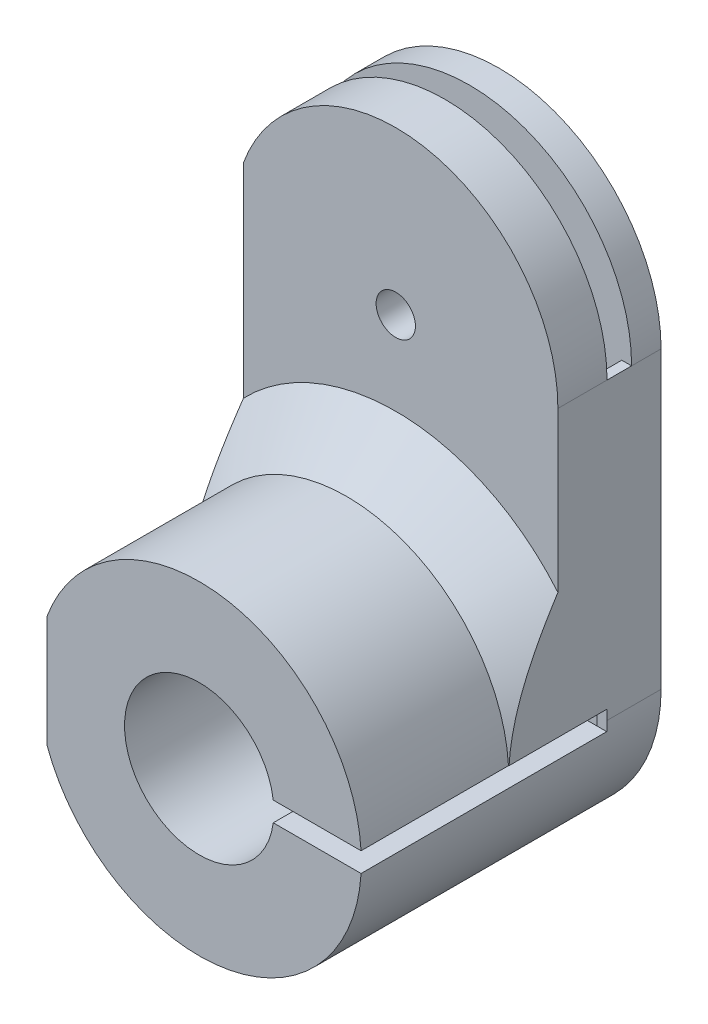
ISO-10303-21;
HEADER;
FILE_DESCRIPTION(('STEP AP214'),'2;1');
FILE_NAME('part.step','',(''),(''),'','','');
FILE_SCHEMA(('AUTOMOTIVE_DESIGN { 1 0 10303 214 1 1 1 1 }'));
ENDSEC;
DATA;
#1=APPLICATION_CONTEXT('core data for automotive mechanical design processes');
#2=APPLICATION_PROTOCOL_DEFINITION('international standard','automotive_design',2000,#1);
#3=PRODUCT_CONTEXT('',#1,'mechanical');
#4=PRODUCT('Part','Part','',(#3));
#5=PRODUCT_RELATED_PRODUCT_CATEGORY('part','',(#4));
#6=PRODUCT_DEFINITION_FORMATION('','',#4);
#7=PRODUCT_DEFINITION_CONTEXT('part definition',#1,'design');
#8=PRODUCT_DEFINITION('design','',#6,#7);
#9=PRODUCT_DEFINITION_SHAPE('','',#8);
#10=(LENGTH_UNIT() NAMED_UNIT(*) SI_UNIT(.MILLI.,.METRE.));
#11=(NAMED_UNIT(*) PLANE_ANGLE_UNIT() SI_UNIT($,.RADIAN.));
#12=(NAMED_UNIT(*) SI_UNIT($,.STERADIAN.) SOLID_ANGLE_UNIT());
#13=UNCERTAINTY_MEASURE_WITH_UNIT(LENGTH_MEASURE(1.E-05),#10,'distance_accuracy_value','');
#14=(GEOMETRIC_REPRESENTATION_CONTEXT(3) GLOBAL_UNCERTAINTY_ASSIGNED_CONTEXT((#13)) GLOBAL_UNIT_ASSIGNED_CONTEXT((#10,
#11,#12)) REPRESENTATION_CONTEXT('',''));
#15=CARTESIAN_POINT('',(0.,0.,0.));
#16=DIRECTION('',(0.,0.,1.));
#17=DIRECTION('',(1.,0.,0.));
#18=AXIS2_PLACEMENT_3D('',#15,#16,#17);
#19=CARTESIAN_POINT('',(0.,0.,0.));
#20=DIRECTION('',(0.,0.,1.));
#21=DIRECTION('',(1.,0.,0.));
#22=AXIS2_PLACEMENT_3D('',#19,#20,#21);
#23=PLANE('',#22);
#24=CARTESIAN_POINT('',(0.,30.,0.));
#25=DIRECTION('',(0.,0.,1.));
#26=DIRECTION('',(1.,0.,0.));
#27=AXIS2_PLACEMENT_3D('',#24,#25,#26);
#28=CIRCLE('',#27,2.);
#29=CARTESIAN_POINT('',(2.,30.,0.));
#30=VERTEX_POINT('',#29);
#31=EDGE_CURVE('E216',#30,#30,#28,.T.);
#32=ORIENTED_EDGE('',*,*,#31,.T.);
#33=EDGE_LOOP('',(#32));
#34=FACE_BOUND('',#33,.T.);
#35=DIRECTION('',(0.,-1.,0.));
#36=VECTOR('',#35,1.);
#37=CARTESIAN_POINT('',(-15.5,0.,0.));
#38=LINE('',#37,#36);
#39=CARTESIAN_POINT('',(-15.5,35.6568542494924,0.));
#40=VERTEX_POINT('',#39);
#41=CARTESIAN_POINT('',(-15.5,0.,0.));
#42=VERTEX_POINT('',#41);
#43=EDGE_CURVE('E381',#40,#42,#38,.T.);
#44=ORIENTED_EDGE('',*,*,#43,.F.);
#45=CARTESIAN_POINT('',(0.,30.,0.));
#46=DIRECTION('',(0.,0.,1.));
#47=DIRECTION('',(-1.,0.,0.));
#48=AXIS2_PLACEMENT_3D('',#45,#46,#47);
#49=CIRCLE('',#48,16.5);
#50=CARTESIAN_POINT('',(16.5,30.,0.));
#51=VERTEX_POINT('',#50);
#52=EDGE_CURVE('E220',#51,#40,#49,.T.);
#53=ORIENTED_EDGE('',*,*,#52,.F.);
#54=DIRECTION('',(-1.,0.,0.));
#55=VECTOR('',#54,1.);
#56=CARTESIAN_POINT('',(0.,30.,0.));
#57=LINE('',#56,#55);
#58=CARTESIAN_POINT('',(15.5,30.,0.));
#59=VERTEX_POINT('',#58);
#60=EDGE_CURVE('E196',#51,#59,#57,.T.);
#61=ORIENTED_EDGE('',*,*,#60,.T.);
#62=DIRECTION('',(0.,-1.,0.));
#63=VECTOR('',#62,1.);
#64=CARTESIAN_POINT('',(15.5,0.,0.));
#65=LINE('',#64,#63);
#66=CARTESIAN_POINT('',(15.5,1.,0.));
#67=VERTEX_POINT('',#66);
#68=EDGE_CURVE('E409',#59,#67,#65,.T.);
#69=ORIENTED_EDGE('',*,*,#68,.T.);
#70=DIRECTION('',(-1.,0.,0.));
#71=VECTOR('',#70,1.);
#72=CARTESIAN_POINT('',(0.,1.,0.));
#73=LINE('',#72,#71);
#74=CARTESIAN_POINT('',(7.53392328073495,1.,0.));
#75=VERTEX_POINT('',#74);
#76=EDGE_CURVE('E383',#67,#75,#73,.T.);
#77=ORIENTED_EDGE('',*,*,#76,.T.);
#78=CARTESIAN_POINT('',(0.,0.,0.));
#79=DIRECTION('',(0.,0.,1.));
#80=DIRECTION('',(1.,0.,0.));
#81=AXIS2_PLACEMENT_3D('',#78,#79,#80);
#82=CIRCLE('',#81,7.6);
#83=CARTESIAN_POINT('',(7.53392328073495,-1.,0.));
#84=VERTEX_POINT('',#83);
#85=EDGE_CURVE('E213',#75,#84,#82,.T.);
#86=ORIENTED_EDGE('',*,*,#85,.T.);
#87=DIRECTION('',(-1.,0.,0.));
#88=VECTOR('',#87,1.);
#89=CARTESIAN_POINT('',(0.,-1.,0.));
#90=LINE('',#89,#88);
#91=CARTESIAN_POINT('',(15.467708298258,-1.,0.));
#92=VERTEX_POINT('',#91);
#93=EDGE_CURVE('E391',#92,#84,#90,.T.);
#94=ORIENTED_EDGE('',*,*,#93,.F.);
#95=CARTESIAN_POINT('',(0.,0.,0.));
#96=DIRECTION('',(0.,0.,1.));
#97=DIRECTION('',(1.,0.,0.));
#98=AXIS2_PLACEMENT_3D('',#95,#96,#97);
#99=CIRCLE('',#98,15.5);
#100=EDGE_CURVE('E246',#92,#42,#99,.F.);
#101=ORIENTED_EDGE('',*,*,#100,.T.);
#102=EDGE_LOOP('',(#44,#53,#61,#69,#77,#86,#94,#101));
#103=FACE_BOUND('',#102,.T.);
#104=ADVANCED_FACE('F33',(#34,#103),#23,.F.);
#105=CARTESIAN_POINT('',(0.,0.,5.));
#106=DIRECTION('',(0.,0.,-1.));
#107=DIRECTION('',(-1.,0.,0.));
#108=AXIS2_PLACEMENT_3D('',#105,#106,#107);
#109=CYLINDRICAL_SURFACE('',#108,16.5);
#110=DIRECTION('',(0.,0.,-1.));
#111=VECTOR('',#110,1.);
#112=CARTESIAN_POINT('',(-15.5,5.65685424949238,5.));
#113=LINE('',#112,#111);
#114=CARTESIAN_POINT('',(-15.5,5.65685424949238,25.));
#115=VERTEX_POINT('',#114);
#116=CARTESIAN_POINT('',(-15.5,5.65685424949238,10.));
#117=VERTEX_POINT('',#116);
#118=EDGE_CURVE('E270',#115,#117,#113,.T.);
#119=ORIENTED_EDGE('',*,*,#118,.F.);
#120=CARTESIAN_POINT('',(0.,0.,25.));
#121=DIRECTION('',(0.,0.,1.));
#122=DIRECTION('',(1.,0.,0.));
#123=AXIS2_PLACEMENT_3D('',#120,#121,#122);
#124=CIRCLE('',#123,16.5);
#125=CARTESIAN_POINT('',(16.4696690920006,1.,25.));
#126=VERTEX_POINT('',#125);
#127=EDGE_CURVE('E210',#126,#115,#124,.T.);
#128=ORIENTED_EDGE('',*,*,#127,.F.);
#129=DIRECTION('',(0.,0.,-1.));
#130=VECTOR('',#129,1.);
#131=CARTESIAN_POINT('',(16.4696690920006,1.,5.));
#132=LINE('',#131,#130);
#133=CARTESIAN_POINT('',(16.4696690920006,1.,10.));
#134=VERTEX_POINT('',#133);
#135=EDGE_CURVE('E286',#134,#126,#132,.F.);
#136=ORIENTED_EDGE('',*,*,#135,.F.);
#137=CARTESIAN_POINT('',(0.,0.,10.));
#138=DIRECTION('',(0.,0.,1.));
#139=DIRECTION('',(1.,0.,0.));
#140=AXIS2_PLACEMENT_3D('',#137,#138,#139);
#141=CIRCLE('',#140,16.5);
#142=EDGE_CURVE('E234',#134,#117,#141,.T.);
#143=ORIENTED_EDGE('',*,*,#142,.T.);
#144=EDGE_LOOP('',(#119,#128,#136,#143));
#145=FACE_BOUND('',#144,.T.);
#146=ADVANCED_FACE('F257',(#145),#109,.T.);
#147=DIRECTION('',(0.,0.,-1.));
#148=VECTOR('',#147,1.);
#149=CARTESIAN_POINT('',(-15.5,-5.65685424949238,5.));
#150=LINE('',#149,#148);
#151=CARTESIAN_POINT('',(-15.5,-5.65685424949238,-5.5));
#152=VERTEX_POINT('',#151);
#153=CARTESIAN_POINT('',(-15.5,-5.65685424949238,25.));
#154=VERTEX_POINT('',#153);
#155=EDGE_CURVE('E165',#152,#154,#150,.F.);
#156=ORIENTED_EDGE('',*,*,#155,.F.);
#157=CARTESIAN_POINT('',(0.,0.,-5.5));
#158=DIRECTION('',(0.,0.,-1.));
#159=DIRECTION('',(-1.,0.,0.));
#160=AXIS2_PLACEMENT_3D('',#157,#158,#159);
#161=CIRCLE('',#160,16.5);
#162=CARTESIAN_POINT('',(16.5,0.,-5.5));
#163=VERTEX_POINT('',#162);
#164=EDGE_CURVE('E164',#163,#152,#161,.T.);
#165=ORIENTED_EDGE('',*,*,#164,.F.);
#166=DIRECTION('',(0.,0.,-1.));
#167=VECTOR('',#166,1.);
#168=CARTESIAN_POINT('',(16.5,0.,5.));
#169=LINE('',#168,#167);
#170=CARTESIAN_POINT('',(16.5,0.,0.));
#171=VERTEX_POINT('',#170);
#172=EDGE_CURVE('E232',#171,#163,#169,.T.);
#173=ORIENTED_EDGE('',*,*,#172,.F.);
#174=CARTESIAN_POINT('',(0.,0.,0.));
#175=DIRECTION('',(0.,0.,1.));
#176=DIRECTION('',(1.,0.,0.));
#177=AXIS2_PLACEMENT_3D('',#174,#175,#176);
#178=CIRCLE('',#177,16.5);
#179=CARTESIAN_POINT('',(16.4696690920006,-1.,0.));
#180=VERTEX_POINT('',#179);
#181=EDGE_CURVE('E299',#180,#171,#178,.T.);
#182=ORIENTED_EDGE('',*,*,#181,.F.);
#183=DIRECTION('',(0.,0.,-1.));
#184=VECTOR('',#183,1.);
#185=CARTESIAN_POINT('',(16.4696690920006,-1.,5.));
#186=LINE('',#185,#184);
#187=CARTESIAN_POINT('',(16.4696690920006,-1.,25.));
#188=VERTEX_POINT('',#187);
#189=EDGE_CURVE('E294',#180,#188,#186,.F.);
#190=ORIENTED_EDGE('',*,*,#189,.T.);
#191=EDGE_CURVE('E209',#154,#188,#124,.T.);
#192=ORIENTED_EDGE('',*,*,#191,.F.);
#193=EDGE_LOOP('',(#156,#165,#173,#182,#190,#192));
#194=FACE_BOUND('',#193,.T.);
#195=ADVANCED_FACE('F259',(#194),#109,.T.);
#196=CARTESIAN_POINT('',(0.,0.,25.));
#197=DIRECTION('',(0.,0.,1.));
#198=DIRECTION('',(1.,0.,0.));
#199=AXIS2_PLACEMENT_3D('',#196,#197,#198);
#200=PLANE('',#199);
#201=ORIENTED_EDGE('',*,*,#127,.T.);
#202=DIRECTION('',(0.,-1.,0.));
#203=VECTOR('',#202,1.);
#204=CARTESIAN_POINT('',(-15.5,0.,25.));
#205=LINE('',#204,#203);
#206=EDGE_CURVE('E275',#115,#154,#205,.T.);
#207=ORIENTED_EDGE('',*,*,#206,.T.);
#208=ORIENTED_EDGE('',*,*,#191,.T.);
#209=DIRECTION('',(1.,0.,0.));
#210=VECTOR('',#209,1.);
#211=CARTESIAN_POINT('',(0.,-1.,25.));
#212=LINE('',#211,#210);
#213=CARTESIAN_POINT('',(7.53392328073495,-1.,25.));
#214=VERTEX_POINT('',#213);
#215=EDGE_CURVE('E42',#214,#188,#212,.T.);
#216=ORIENTED_EDGE('',*,*,#215,.F.);
#217=CARTESIAN_POINT('',(0.,0.,25.));
#218=DIRECTION('',(0.,0.,1.));
#219=DIRECTION('',(1.,0.,0.));
#220=AXIS2_PLACEMENT_3D('',#217,#218,#219);
#221=CIRCLE('',#220,7.6);
#222=CARTESIAN_POINT('',(7.53392328073495,1.,25.));
#223=VERTEX_POINT('',#222);
#224=EDGE_CURVE('E206',#223,#214,#221,.T.);
#225=ORIENTED_EDGE('',*,*,#224,.F.);
#226=DIRECTION('',(1.,0.,0.));
#227=VECTOR('',#226,1.);
#228=CARTESIAN_POINT('',(0.,1.,25.));
#229=LINE('',#228,#227);
#230=EDGE_CURVE('E282',#223,#126,#229,.T.);
#231=ORIENTED_EDGE('',*,*,#230,.T.);
#232=EDGE_LOOP('',(#201,#207,#208,#216,#225,#231));
#233=FACE_BOUND('',#232,.T.);
#234=ADVANCED_FACE('F265',(#233),#200,.T.);
#235=CARTESIAN_POINT('',(0.,0.,10.));
#236=DIRECTION('',(0.,0.,-1.));
#237=DIRECTION('',(-1.,0.,0.));
#238=AXIS2_PLACEMENT_3D('',#235,#236,#237);
#239=CONICAL_SURFACE('',#238,16.5,0.785398163397443);
#240=CARTESIAN_POINT('',(-15.5,-13.4883542311077,5.95284204898787));
#241=CARTESIAN_POINT('',(-15.5,-13.1619832522316,6.16705353127233));
#242=CARTESIAN_POINT('',(-15.5,-12.8335937065472,6.37823790255222));
#243=CARTESIAN_POINT('',(-15.5,-12.1722333871304,6.79348836651693));
#244=CARTESIAN_POINT('',(-15.5,-11.8392614725238,6.99755264010608));
#245=CARTESIAN_POINT('',(-15.5,-11.1666570638379,7.3984024055747));
#246=CARTESIAN_POINT('',(-15.5,-10.8269993634294,7.59514575939079));
#247=CARTESIAN_POINT('',(-15.5,-10.1422085932458,7.97882476474934));
#248=CARTESIAN_POINT('',(-15.5,-9.7970758812883,8.16576105381804));
#249=CARTESIAN_POINT('',(-15.5,-9.09088478248684,8.53334381616271));
#250=CARTESIAN_POINT('',(-15.5,-8.72965279622625,8.71365942488712));
#251=CARTESIAN_POINT('',(-15.5,-8.00042044868424,9.05999601914646));
#252=CARTESIAN_POINT('',(-15.5,-7.63241960669504,9.22601598464545));
#253=CARTESIAN_POINT('',(-15.5,-6.51899529138525,9.69832885620541));
#254=CARTESIAN_POINT('',(-15.5,-5.76249791704777,9.97975894141957));
#255=CARTESIAN_POINT('',(-15.5,-4.53317338678211,10.3566110685937));
#256=CARTESIAN_POINT('',(-15.5,-4.06925437505357,10.4812416084303));
#257=CARTESIAN_POINT('',(-15.5,-3.13278403080684,10.6931498792374));
#258=CARTESIAN_POINT('',(-15.5,-2.66023247665344,10.7804266497635));
#259=CARTESIAN_POINT('',(-15.5,-1.71433324313486,10.91243684098));
#260=CARTESIAN_POINT('',(-15.5,-1.2410488966195,10.957618129778));
#261=CARTESIAN_POINT('',(-15.5,-0.292320742154641,11.004482095324));
#262=CARTESIAN_POINT('',(-15.5,0.183122928344076,11.0061675030197));
#263=CARTESIAN_POINT('',(-15.5,1.13353822545524,10.965883898091));
#264=CARTESIAN_POINT('',(-15.5,1.60850427295816,10.9237854383831));
#265=CARTESIAN_POINT('',(-15.5,2.55288316159106,10.7981528355441));
#266=CARTESIAN_POINT('',(-15.5,3.0222954219117,10.7146143972008));
#267=CARTESIAN_POINT('',(-15.5,3.95548989711239,10.5097742119244));
#268=CARTESIAN_POINT('',(-15.5,4.41922495847328,10.3882605621542));
#269=CARTESIAN_POINT('',(-15.5,5.33683050095344,10.1128068694402));
#270=CARTESIAN_POINT('',(-15.5,5.79070102235302,9.95886695893127));
#271=CARTESIAN_POINT('',(-15.5,6.78858348458831,9.58624318689272));
#272=CARTESIAN_POINT('',(-15.5,7.33004770955227,9.36077951327062));
#273=CARTESIAN_POINT('',(-15.5,8.39841228078049,8.87739582954841));
#274=CARTESIAN_POINT('',(-15.5,8.92530521990447,8.61945966933635));
#275=CARTESIAN_POINT('',(-15.5,9.96669444782814,8.07754250933706));
#276=CARTESIAN_POINT('',(-15.5,10.4811652170735,7.79351284440653));
#277=CARTESIAN_POINT('',(-15.5,11.4982359113583,7.20524936091089));
#278=CARTESIAN_POINT('',(-15.5,12.0008376957541,6.90101873581001));
#279=CARTESIAN_POINT('',(-15.5,13.0006681003233,6.2734206409208));
#280=CARTESIAN_POINT('',(-15.5,13.4977981944576,5.94989694446391));
#281=CARTESIAN_POINT('',(-15.5,14.4831958095876,5.28964298320991));
#282=CARTESIAN_POINT('',(-15.5,14.9714630752239,4.95291233876956));
#283=CARTESIAN_POINT('',(-15.5,15.9398854812326,4.26910838714908));
#284=CARTESIAN_POINT('',(-15.5,16.4200488469545,3.92204669580113));
#285=CARTESIAN_POINT('',(-15.5,17.3738849451342,3.21914868456798));
#286=CARTESIAN_POINT('',(-15.5,17.8475577492467,2.86331246167366));
#287=CARTESIAN_POINT('',(-15.5,18.9716725994811,2.00518333289196));
#288=CARTESIAN_POINT('',(-15.5,19.6195467649418,1.4995294316936));
#289=CARTESIAN_POINT('',(-15.5,20.9065882173327,0.477263920757578));
#290=CARTESIAN_POINT('',(-15.5,21.545755283161,-0.0393479663908997));
#291=CARTESIAN_POINT('',(-15.5,22.8172028935836,-1.08155426375353));
#292=CARTESIAN_POINT('',(-15.5,23.4494801399158,-1.60715269116617));
#293=CARTESIAN_POINT('',(-15.5,24.7080737881168,-2.6654411066379));
#294=CARTESIAN_POINT('',(-15.5,25.3343901266641,-3.19813116988593));
#295=CARTESIAN_POINT('',(-15.5,26.561732049975,-4.25190924040628));
#296=CARTESIAN_POINT('',(-15.5,27.1629176555315,-4.77281109040549));
#297=CARTESIAN_POINT('',(-15.5,28.3613135581328,-5.81917151641213));
#298=CARTESIAN_POINT('',(-15.5,28.9585238308936,-6.34463012021028));
#299=CARTESIAN_POINT('',(-15.5,30.1490314173354,-7.39893202318439));
#300=CARTESIAN_POINT('',(-15.5,30.7423316509627,-7.92777202809512));
#301=CARTESIAN_POINT('',(-15.5,31.925975371818,-8.98872606110795));
#302=CARTESIAN_POINT('',(-15.5,32.5163189224001,-9.52084001850839));
#303=CARTESIAN_POINT('',(-15.5,33.1054163632002,-10.0543238561576));
#304=B_SPLINE_CURVE_WITH_KNOTS('',3,(#240,#241,#242,#243,#244,#245,#246,#247,#248,#249,#250,
#251,#252,#253,#254,#255,#256,#257,#258,#259,#260,#261,#262,#263,#264,#265,#266,#267,#268,#269,
#270,#271,#272,#273,#274,#275,#276,#277,#278,#279,#280,#281,#282,#283,#284,#285,#286,#287,#288,
#289,#290,#291,#292,#293,#294,#295,#296,#297,#298,#299,#300,#301,#302,#303),.UNSPECIFIED.,.F.,
.F.,(4,2,2,2,2,2,2,2,2,2,2,2,2,2,2,2,2,2,2,2,2,2,2,2,2,2,2,2,2,2,2,4),(0.,1.17119300864336,
2.34268308343275,3.52011125795475,4.6974627965125,5.90835257926607,7.11932869107438,
9.53567484724216,10.9755337079724,12.415429588291,13.8398248819925,15.2641307428973,
16.6926595699075,18.1213364934508,19.5581322756454,20.994922189807,22.7531207794902,
24.5121972852607,26.2746238337442,28.0367724297053,29.8159107295443,31.5951002095348,
33.3723596488714,35.1495994517429,37.6149686015868,40.0804002390299,42.5469643965116,
45.0135547265533,47.3999198150042,49.7862994676686,52.1706297289689,54.5549086796505),.UNSPECIFIED.);
#305=CARTESIAN_POINT('',(-15.5,14.8996644257513,5.));
#306=VERTEX_POINT('',#305);
#307=EDGE_CURVE('E274',#117,#306,#304,.T.);
#308=ORIENTED_EDGE('',*,*,#307,.F.);
#309=ORIENTED_EDGE('',*,*,#142,.F.);
#310=CARTESIAN_POINT('',(31.2831715319293,1.,-4.79915048521479));
#311=CARTESIAN_POINT('',(30.1008553973261,1.,-3.61744507814936));
#312=CARTESIAN_POINT('',(28.9185116923515,1.,-2.4357672469429));
#313=CARTESIAN_POINT('',(26.5537267769889,1.,-0.072513583927103));
#314=CARTESIAN_POINT('',(25.3712855667876,1.,1.10906224806915));
#315=CARTESIAN_POINT('',(23.0062649787068,1.,3.47206336619539));
#316=CARTESIAN_POINT('',(21.8236856015755,1.,4.65348865307419));
#317=CARTESIAN_POINT('',(19.45829520654,1.,7.0161116459906));
#318=CARTESIAN_POINT('',(18.2754841882182,1.,8.19730935161013));
#319=CARTESIAN_POINT('',(16.500955700651,1.,9.96880602973445));
#320=CARTESIAN_POINT('',(15.9093910590625,1.,10.5592580872199));
#321=CARTESIAN_POINT('',(14.7261186292172,1.,11.740017917072));
#322=CARTESIAN_POINT('',(14.1344108410628,1.,12.3303256895412));
#323=CARTESIAN_POINT('',(12.9507919727244,1.,13.5107308219366));
#324=CARTESIAN_POINT('',(12.358880893688,1.,14.1008281830136));
#325=CARTESIAN_POINT('',(11.1747464485765,1.,15.2807125979036));
#326=CARTESIAN_POINT('',(10.5825230817079,1.,15.8704996509205));
#327=CARTESIAN_POINT('',(9.69379957029781,1.,16.7548014194667));
#328=CARTESIAN_POINT('',(9.39749076098087,1.,17.0495084164266));
#329=CARTESIAN_POINT('',(8.80470288447884,1.,17.6387507185763));
#330=CARTESIAN_POINT('',(8.50822381741781,1.,17.9332860238909));
#331=CARTESIAN_POINT('',(7.91503775261413,1.,18.5221220932866));
#332=CARTESIAN_POINT('',(7.61833075679678,1.,18.8164228593071));
#333=CARTESIAN_POINT('',(7.02459323555713,1.,19.4046995430662));
#334=CARTESIAN_POINT('',(6.72756270928031,1.,19.6986754599427));
#335=CARTESIAN_POINT('',(6.13301957714364,1.,20.2861573591968));
#336=CARTESIAN_POINT('',(5.83550695708718,1.,20.5796633272102));
#337=CARTESIAN_POINT('',(5.23975870565137,1.,21.1659371110513));
#338=CARTESIAN_POINT('',(4.94152307960413,1.,21.4587049322906));
#339=CARTESIAN_POINT('',(4.49324792400735,1.,21.8969246438991));
#340=CARTESIAN_POINT('',(4.34366663120819,1.,22.0428450857491));
#341=CARTESIAN_POINT('',(4.04408619578124,1.,22.3342553157224));
#342=CARTESIAN_POINT('',(3.89408705480348,1.,22.4797451055416));
#343=CARTESIAN_POINT('',(3.59351821633375,1.,22.7701431085312));
#344=CARTESIAN_POINT('',(3.44294850404442,1.,22.9150513064149));
#345=CARTESIAN_POINT('',(3.14095371372834,1.,23.2039772206253));
#346=CARTESIAN_POINT('',(2.98952862392232,1.,23.3479949246317));
#347=CARTESIAN_POINT('',(2.83753356590538,1.,23.4914128336313));
#348=B_SPLINE_CURVE_WITH_KNOTS('',3,(#310,#311,#312,#313,#314,#315,#316,#317,#318,#319,#320,
#321,#322,#323,#324,#325,#326,#327,#328,#329,#330,#331,#332,#333,#334,#335,#336,#337,#338,#339,
#340,#341,#342,#343,#344,#345,#346,#347),.UNSPECIFIED.,.F.,.F.,(4,2,2,2,2,2,2,2,2,2,2,2,2,2,2,2,
2,2,4),(0.,5.01484716582376,10.0296849381957,15.044496708635,20.0593176055556,22.5667547708475,
25.0741901465941,27.58161159189,30.0890394387897,31.3427778477935,32.5965153444058,
33.8502423647396,35.1039727044758,36.3577406602761,37.6114993975888,38.2384006728618,
38.8652994760673,39.4922146502662,40.1191384787745),.UNSPECIFIED.);
#349=CARTESIAN_POINT('',(16.5,0.999999999999146,9.96972474518355));
#350=VERTEX_POINT('',#349);
#351=EDGE_CURVE('E411',#350,#134,#348,.T.);
#352=ORIENTED_EDGE('',*,*,#351,.F.);
#353=CARTESIAN_POINT('',(16.5,13.7840487520902,5.));
#354=CARTESIAN_POINT('',(16.5,13.4425456268306,5.2189052123565));
#355=CARTESIAN_POINT('',(16.5,13.0988742342402,5.43448377999532));
#356=CARTESIAN_POINT('',(16.5,12.4066274426754,5.85783568646688));
#357=CARTESIAN_POINT('',(16.5,12.0580506663048,6.06560677038276));
#358=CARTESIAN_POINT('',(16.5,11.3539615113847,6.47302506923402));
#359=CARTESIAN_POINT('',(16.5,10.9984241457014,6.67262926412509));
#360=CARTESIAN_POINT('',(16.5,10.2815693653873,7.06112411321939));
#361=CARTESIAN_POINT('',(16.5,9.92025244071763,7.25001566947789));
#362=CARTESIAN_POINT('',(16.5,9.20234612287532,7.60979971606665));
#363=CARTESIAN_POINT('',(16.5,8.84594422522538,7.78106378289986));
#364=CARTESIAN_POINT('',(16.5,8.12690326092033,8.1099406529933));
#365=CARTESIAN_POINT('',(16.5,7.76426362930789,8.26755221184696));
#366=CARTESIAN_POINT('',(16.5,6.66779414010523,8.7161473846883));
#367=CARTESIAN_POINT('',(16.5,5.92390633267127,8.98366615755507));
#368=CARTESIAN_POINT('',(16.5,4.7522381620281,9.3338545266994));
#369=CARTESIAN_POINT('',(16.5,4.33301896998583,9.44550641159906));
#370=CARTESIAN_POINT('',(16.5,3.48793530117779,9.64037668202841));
#371=CARTESIAN_POINT('',(16.5,3.0620717849983,9.72359913856154));
#372=CARTESIAN_POINT('',(16.5,2.41620668270184,9.82541507355742));
#373=CARTESIAN_POINT('',(16.5,2.19799201571663,9.855662082048));
#374=CARTESIAN_POINT('',(16.5,1.7605541077037,9.90776036534952));
#375=CARTESIAN_POINT('',(16.5,1.54133088710275,9.92961180944929));
#376=CARTESIAN_POINT('',(16.5,1.1019442539286,9.96469527480129));
#377=CARTESIAN_POINT('',(16.5,0.881780054444317,9.97791744161697));
#378=CARTESIAN_POINT('',(16.5,0.441079104936033,9.99557871182797));
#379=CARTESIAN_POINT('',(16.5,0.22054232100369,10.0000169673364));
#380=CARTESIAN_POINT('',(16.5,0.,10.));
#381=B_SPLINE_CURVE_WITH_KNOTS('',3,(#353,#354,#355,#356,#357,#358,#359,#360,#361,#362,#363,
#364,#365,#366,#367,#368,#369,#370,#371,#372,#373,#374,#375,#376,#377,#378,#379,#380),
.UNSPECIFIED.,.F.,.F.,(4,2,2,2,2,2,2,2,2,2,2,2,2,4),(0.,1.21694547658333,2.4342397651579,
3.65728530392378,4.88022770304341,6.06618496298468,7.2522502077338,9.61930941570027,
10.9200394766905,12.2205831991317,12.8813523789289,13.5421082342227,14.2036173432923,
14.8651903029088),.UNSPECIFIED.);
#382=CARTESIAN_POINT('',(16.5,13.7840487520902,5.));
#383=VERTEX_POINT('',#382);
#384=EDGE_CURVE('E239',#383,#350,#381,.T.);
#385=ORIENTED_EDGE('',*,*,#384,.F.);
#386=CARTESIAN_POINT('',(0.,0.,5.));
#387=DIRECTION('',(0.,0.,1.));
#388=DIRECTION('',(1.,0.,0.));
#389=AXIS2_PLACEMENT_3D('',#386,#387,#388);
#390=CIRCLE('',#389,21.5);
#391=EDGE_CURVE('E237',#306,#383,#390,.F.);
#392=ORIENTED_EDGE('',*,*,#391,.F.);
#393=EDGE_LOOP('',(#308,#309,#352,#385,#392));
#394=FACE_BOUND('',#393,.T.);
#395=ADVANCED_FACE('F35',(#394),#239,.T.);
#396=CARTESIAN_POINT('',(0.,0.,5.));
#397=DIRECTION('',(0.,0.,1.));
#398=DIRECTION('',(1.,0.,0.));
#399=AXIS2_PLACEMENT_3D('',#396,#397,#398);
#400=PLANE('',#399);
#401=CARTESIAN_POINT('',(0.,30.,5.));
#402=DIRECTION('',(0.,0.,1.));
#403=DIRECTION('',(1.,0.,0.));
#404=AXIS2_PLACEMENT_3D('',#401,#402,#403);
#405=CIRCLE('',#404,2.);
#406=CARTESIAN_POINT('',(2.,30.,5.));
#407=VERTEX_POINT('',#406);
#408=EDGE_CURVE('E217',#407,#407,#405,.T.);
#409=ORIENTED_EDGE('',*,*,#408,.F.);
#410=EDGE_LOOP('',(#409));
#411=FACE_BOUND('',#410,.T.);
#412=CARTESIAN_POINT('',(0.,30.,5.));
#413=DIRECTION('',(0.,0.,1.));
#414=DIRECTION('',(-1.,0.,0.));
#415=AXIS2_PLACEMENT_3D('',#412,#413,#414);
#416=CIRCLE('',#415,16.5);
#417=CARTESIAN_POINT('',(16.5,30.,5.));
#418=VERTEX_POINT('',#417);
#419=CARTESIAN_POINT('',(-15.5,35.6568542494924,5.));
#420=VERTEX_POINT('',#419);
#421=EDGE_CURVE('E225',#418,#420,#416,.T.);
#422=ORIENTED_EDGE('',*,*,#421,.T.);
#423=DIRECTION('',(0.,-1.,0.));
#424=VECTOR('',#423,1.);
#425=CARTESIAN_POINT('',(-15.5,0.,5.));
#426=LINE('',#425,#424);
#427=EDGE_CURVE('E372',#420,#306,#426,.T.);
#428=ORIENTED_EDGE('',*,*,#427,.T.);
#429=ORIENTED_EDGE('',*,*,#391,.T.);
#430=DIRECTION('',(0.,1.,0.));
#431=VECTOR('',#430,1.);
#432=CARTESIAN_POINT('',(16.5,30.,5.));
#433=LINE('',#432,#431);
#434=EDGE_CURVE('E223',#383,#418,#433,.T.);
#435=ORIENTED_EDGE('',*,*,#434,.T.);
#436=EDGE_LOOP('',(#422,#428,#429,#435));
#437=FACE_BOUND('',#436,.T.);
#438=ADVANCED_FACE('F359',(#411,#437),#400,.T.);
#439=CARTESIAN_POINT('',(0.,30.,5.));
#440=DIRECTION('',(0.,0.,-1.));
#441=DIRECTION('',(-1.,0.,0.));
#442=AXIS2_PLACEMENT_3D('',#439,#440,#441);
#443=CYLINDRICAL_SURFACE('',#442,16.5);
#444=DIRECTION('',(0.,0.,-1.));
#445=VECTOR('',#444,1.);
#446=CARTESIAN_POINT('',(-15.5,35.6568542494924,5.));
#447=LINE('',#446,#445);
#448=EDGE_CURVE('E378',#420,#40,#447,.T.);
#449=ORIENTED_EDGE('',*,*,#448,.F.);
#450=ORIENTED_EDGE('',*,*,#421,.F.);
#451=DIRECTION('',(0.,0.,-1.));
#452=VECTOR('',#451,1.);
#453=CARTESIAN_POINT('',(16.5,30.,5.));
#454=LINE('',#453,#452);
#455=EDGE_CURVE('E228',#418,#51,#454,.T.);
#456=ORIENTED_EDGE('',*,*,#455,.T.);
#457=ORIENTED_EDGE('',*,*,#52,.T.);
#458=EDGE_LOOP('',(#449,#450,#456,#457));
#459=FACE_BOUND('',#458,.T.);
#460=ADVANCED_FACE('F255',(#459),#443,.T.);
#461=CARTESIAN_POINT('',(0.,0.,-5.5));
#462=DIRECTION('',(0.,0.,-1.));
#463=DIRECTION('',(-1.,0.,0.));
#464=AXIS2_PLACEMENT_3D('',#461,#462,#463);
#465=PLANE('',#464);
#466=CARTESIAN_POINT('',(0.,0.,-5.5));
#467=DIRECTION('',(0.,0.,-1.));
#468=DIRECTION('',(-1.,0.,0.));
#469=AXIS2_PLACEMENT_3D('',#466,#467,#468);
#470=CIRCLE('',#469,7.6);
#471=CARTESIAN_POINT('',(-7.6,0.,-5.5));
#472=VERTEX_POINT('',#471);
#473=EDGE_CURVE('E175',#472,#472,#470,.T.);
#474=ORIENTED_EDGE('',*,*,#473,.F.);
#475=EDGE_LOOP('',(#474));
#476=FACE_BOUND('',#475,.T.);
#477=CARTESIAN_POINT('',(0.,30.,-5.5));
#478=DIRECTION('',(0.,0.,-1.));
#479=DIRECTION('',(-1.,0.,0.));
#480=AXIS2_PLACEMENT_3D('',#477,#478,#479);
#481=CIRCLE('',#480,2.);
#482=CARTESIAN_POINT('',(-2.,30.,-5.5));
#483=VERTEX_POINT('',#482);
#484=EDGE_CURVE('E305',#483,#483,#481,.T.);
#485=ORIENTED_EDGE('',*,*,#484,.F.);
#486=EDGE_LOOP('',(#485));
#487=FACE_BOUND('',#486,.T.);
#488=ORIENTED_EDGE('',*,*,#164,.T.);
#489=DIRECTION('',(0.,1.,0.));
#490=VECTOR('',#489,1.);
#491=CARTESIAN_POINT('',(-15.5,0.,-5.5));
#492=LINE('',#491,#490);
#493=CARTESIAN_POINT('',(-15.5,35.6568542494924,-5.5));
#494=VERTEX_POINT('',#493);
#495=EDGE_CURVE('E152',#152,#494,#492,.T.);
#496=ORIENTED_EDGE('',*,*,#495,.T.);
#497=CARTESIAN_POINT('',(0.,30.,-5.5));
#498=DIRECTION('',(0.,0.,-1.));
#499=DIRECTION('',(-1.,0.,0.));
#500=AXIS2_PLACEMENT_3D('',#497,#498,#499);
#501=CIRCLE('',#500,16.5);
#502=CARTESIAN_POINT('',(16.5,30.,-5.5));
#503=VERTEX_POINT('',#502);
#504=EDGE_CURVE('E161',#494,#503,#501,.T.);
#505=ORIENTED_EDGE('',*,*,#504,.T.);
#506=DIRECTION('',(0.,-1.,0.));
#507=VECTOR('',#506,1.);
#508=CARTESIAN_POINT('',(16.5,30.,-5.5));
#509=LINE('',#508,#507);
#510=EDGE_CURVE('E189',#503,#163,#509,.T.);
#511=ORIENTED_EDGE('',*,*,#510,.T.);
#512=EDGE_LOOP('',(#488,#496,#505,#511));
#513=FACE_BOUND('',#512,.T.);
#514=ADVANCED_FACE('F159',(#476,#487,#513),#465,.T.);
#515=CARTESIAN_POINT('',(0.,0.,-2.5));
#516=DIRECTION('',(0.,0.,-1.));
#517=DIRECTION('',(-1.,0.,0.));
#518=AXIS2_PLACEMENT_3D('',#515,#516,#517);
#519=PLANE('',#518);
#520=CARTESIAN_POINT('',(0.,30.,-2.5));
#521=DIRECTION('',(0.,0.,-1.));
#522=DIRECTION('',(-1.,0.,0.));
#523=AXIS2_PLACEMENT_3D('',#520,#521,#522);
#524=CIRCLE('',#523,2.);
#525=CARTESIAN_POINT('',(-2.,30.,-2.5));
#526=VERTEX_POINT('',#525);
#527=EDGE_CURVE('E304',#526,#526,#524,.T.);
#528=ORIENTED_EDGE('',*,*,#527,.T.);
#529=EDGE_LOOP('',(#528));
#530=FACE_BOUND('',#529,.T.);
#531=CARTESIAN_POINT('',(0.,0.,-2.5));
#532=DIRECTION('',(0.,0.,-1.));
#533=DIRECTION('',(-1.,0.,0.));
#534=AXIS2_PLACEMENT_3D('',#531,#532,#533);
#535=CIRCLE('',#534,7.6);
#536=CARTESIAN_POINT('',(-7.6,0.,-2.5));
#537=VERTEX_POINT('',#536);
#538=EDGE_CURVE('E178',#537,#537,#535,.T.);
#539=ORIENTED_EDGE('',*,*,#538,.T.);
#540=EDGE_LOOP('',(#539));
#541=FACE_BOUND('',#540,.T.);
#542=DIRECTION('',(0.,1.,0.));
#543=VECTOR('',#542,1.);
#544=CARTESIAN_POINT('',(-15.5,0.,-2.5));
#545=LINE('',#544,#543);
#546=CARTESIAN_POINT('',(-15.5,0.,-2.5));
#547=VERTEX_POINT('',#546);
#548=CARTESIAN_POINT('',(-15.5,35.6568542494924,-2.5));
#549=VERTEX_POINT('',#548);
#550=EDGE_CURVE('E48',#547,#549,#545,.T.);
#551=ORIENTED_EDGE('',*,*,#550,.F.);
#552=CARTESIAN_POINT('',(0.,0.,-2.5));
#553=DIRECTION('',(0.,0.,-1.));
#554=DIRECTION('',(-1.,0.,0.));
#555=AXIS2_PLACEMENT_3D('',#552,#553,#554);
#556=CIRCLE('',#555,15.5);
#557=CARTESIAN_POINT('',(15.5,0.,-2.5));
#558=VERTEX_POINT('',#557);
#559=EDGE_CURVE('E173',#558,#547,#556,.T.);
#560=ORIENTED_EDGE('',*,*,#559,.F.);
#561=DIRECTION('',(0.,-1.,0.));
#562=VECTOR('',#561,1.);
#563=CARTESIAN_POINT('',(15.5,30.,-2.5));
#564=LINE('',#563,#562);
#565=CARTESIAN_POINT('',(15.5,30.,-2.5));
#566=VERTEX_POINT('',#565);
#567=EDGE_CURVE('E183',#566,#558,#564,.T.);
#568=ORIENTED_EDGE('',*,*,#567,.F.);
#569=DIRECTION('',(-1.,0.,0.));
#570=VECTOR('',#569,1.);
#571=CARTESIAN_POINT('',(16.5,30.,-2.5));
#572=LINE('',#571,#570);
#573=CARTESIAN_POINT('',(16.5,30.,-2.5));
#574=VERTEX_POINT('',#573);
#575=EDGE_CURVE('E186',#574,#566,#572,.T.);
#576=ORIENTED_EDGE('',*,*,#575,.F.);
#577=CARTESIAN_POINT('',(0.,30.,-2.5));
#578=DIRECTION('',(0.,0.,-1.));
#579=DIRECTION('',(-1.,0.,0.));
#580=AXIS2_PLACEMENT_3D('',#577,#578,#579);
#581=CIRCLE('',#580,16.5);
#582=EDGE_CURVE('E171',#549,#574,#581,.T.);
#583=ORIENTED_EDGE('',*,*,#582,.F.);
#584=EDGE_LOOP('',(#551,#560,#568,#576,#583));
#585=FACE_BOUND('',#584,.T.);
#586=ADVANCED_FACE('F315',(#530,#541,#585),#519,.F.);
#587=CARTESIAN_POINT('',(0.,30.,-5.5));
#588=DIRECTION('',(0.,0.,1.));
#589=DIRECTION('',(1.,0.,0.));
#590=AXIS2_PLACEMENT_3D('',#587,#588,#589);
#591=CYLINDRICAL_SURFACE('',#590,16.5);
#592=DIRECTION('',(0.,0.,1.));
#593=VECTOR('',#592,1.);
#594=CARTESIAN_POINT('',(-15.5,35.6568542494924,-5.5));
#595=LINE('',#594,#593);
#596=EDGE_CURVE('E11',#549,#494,#595,.F.);
#597=ORIENTED_EDGE('',*,*,#596,.F.);
#598=ORIENTED_EDGE('',*,*,#582,.T.);
#599=DIRECTION('',(0.,0.,1.));
#600=VECTOR('',#599,1.);
#601=CARTESIAN_POINT('',(16.5,30.,-5.5));
#602=LINE('',#601,#600);
#603=EDGE_CURVE('E169',#503,#574,#602,.T.);
#604=ORIENTED_EDGE('',*,*,#603,.F.);
#605=ORIENTED_EDGE('',*,*,#504,.F.);
#606=EDGE_LOOP('',(#597,#598,#604,#605));
#607=FACE_BOUND('',#606,.T.);
#608=ADVANCED_FACE('F167',(#607),#591,.T.);
#609=CARTESIAN_POINT('',(16.5,30.,5.));
#610=DIRECTION('',(-1.,0.,0.));
#611=DIRECTION('',(0.,0.,1.));
#612=AXIS2_PLACEMENT_3D('',#609,#610,#611);
#613=PLANE('',#612);
#614=DIRECTION('',(0.,0.,1.));
#615=VECTOR('',#614,1.);
#616=CARTESIAN_POINT('',(16.5,1.,5.));
#617=LINE('',#616,#615);
#618=CARTESIAN_POINT('',(16.5,1.,0.));
#619=VERTEX_POINT('',#618);
#620=EDGE_CURVE('E56',#619,#350,#617,.T.);
#621=ORIENTED_EDGE('',*,*,#620,.F.);
#622=DIRECTION('',(0.,1.,0.));
#623=VECTOR('',#622,1.);
#624=CARTESIAN_POINT('',(16.5,30.,0.));
#625=LINE('',#624,#623);
#626=EDGE_CURVE('E297',#171,#619,#625,.T.);
#627=ORIENTED_EDGE('',*,*,#626,.F.);
#628=ORIENTED_EDGE('',*,*,#172,.T.);
#629=ORIENTED_EDGE('',*,*,#510,.F.);
#630=ORIENTED_EDGE('',*,*,#603,.T.);
#631=DIRECTION('',(0.,0.,-1.));
#632=VECTOR('',#631,1.);
#633=CARTESIAN_POINT('',(16.5,30.,0.500000000000011));
#634=LINE('',#633,#632);
#635=EDGE_CURVE('E192',#51,#574,#634,.T.);
#636=ORIENTED_EDGE('',*,*,#635,.F.);
#637=ORIENTED_EDGE('',*,*,#455,.F.);
#638=ORIENTED_EDGE('',*,*,#434,.F.);
#639=ORIENTED_EDGE('',*,*,#384,.T.);
#640=EDGE_LOOP('',(#621,#627,#628,#629,#630,#636,#637,#638,#639));
#641=FACE_BOUND('',#640,.T.);
#642=ADVANCED_FACE('F249',(#641),#613,.F.);
#643=CARTESIAN_POINT('',(0.,0.,5.));
#644=DIRECTION('',(0.,0.,-1.));
#645=DIRECTION('',(-1.,0.,0.));
#646=AXIS2_PLACEMENT_3D('',#643,#644,#645);
#647=CYLINDRICAL_SURFACE('',#646,7.6);
#648=ORIENTED_EDGE('',*,*,#85,.F.);
#649=DIRECTION('',(0.,0.,-1.));
#650=VECTOR('',#649,1.);
#651=CARTESIAN_POINT('',(7.53392328073495,1.,5.));
#652=LINE('',#651,#650);
#653=EDGE_CURVE('E285',#75,#223,#652,.F.);
#654=ORIENTED_EDGE('',*,*,#653,.T.);
#655=ORIENTED_EDGE('',*,*,#224,.T.);
#656=DIRECTION('',(0.,0.,-1.));
#657=VECTOR('',#656,1.);
#658=CARTESIAN_POINT('',(7.53392328073495,-1.,5.));
#659=LINE('',#658,#657);
#660=EDGE_CURVE('E288',#84,#214,#659,.F.);
#661=ORIENTED_EDGE('',*,*,#660,.F.);
#662=EDGE_LOOP('',(#648,#654,#655,#661));
#663=FACE_BOUND('',#662,.T.);
#664=ADVANCED_FACE('F253',(#663),#647,.F.);
#665=CARTESIAN_POINT('',(15.5,30.,0.500000000000011));
#666=DIRECTION('',(-1.,0.,0.));
#667=DIRECTION('',(0.,0.,1.));
#668=AXIS2_PLACEMENT_3D('',#665,#666,#667);
#669=PLANE('',#668);
#670=DIRECTION('',(0.,0.,-1.));
#671=VECTOR('',#670,1.);
#672=CARTESIAN_POINT('',(15.5,30.,0.500000000000011));
#673=LINE('',#672,#671);
#674=EDGE_CURVE('E193',#59,#566,#673,.T.);
#675=ORIENTED_EDGE('',*,*,#674,.T.);
#676=ORIENTED_EDGE('',*,*,#567,.T.);
#677=DIRECTION('',(0.,0.,-1.));
#678=VECTOR('',#677,1.);
#679=CARTESIAN_POINT('',(15.5,0.,0.500000000000011));
#680=LINE('',#679,#678);
#681=CARTESIAN_POINT('',(15.5,0.,0.));
#682=VERTEX_POINT('',#681);
#683=EDGE_CURVE('E197',#682,#558,#680,.T.);
#684=ORIENTED_EDGE('',*,*,#683,.F.);
#685=DIRECTION('',(0.,1.,0.));
#686=VECTOR('',#685,1.);
#687=CARTESIAN_POINT('',(15.5,30.,0.));
#688=LINE('',#687,#686);
#689=EDGE_CURVE('E301',#682,#67,#688,.T.);
#690=ORIENTED_EDGE('',*,*,#689,.T.);
#691=ORIENTED_EDGE('',*,*,#68,.F.);
#692=EDGE_LOOP('',(#675,#676,#684,#690,#691));
#693=FACE_BOUND('',#692,.T.);
#694=ADVANCED_FACE('F343',(#693),#669,.T.);
#695=CARTESIAN_POINT('',(0.,0.,0.500000000000011));
#696=DIRECTION('',(0.,0.,-1.));
#697=DIRECTION('',(-1.,0.,0.));
#698=AXIS2_PLACEMENT_3D('',#695,#696,#697);
#699=CYLINDRICAL_SURFACE('',#698,15.5);
#700=ORIENTED_EDGE('',*,*,#683,.T.);
#701=ORIENTED_EDGE('',*,*,#559,.T.);
#702=DIRECTION('',(0.,0.,-1.));
#703=VECTOR('',#702,1.);
#704=CARTESIAN_POINT('',(-15.5,0.,0.500000000000011));
#705=LINE('',#704,#703);
#706=EDGE_CURVE('E200',#42,#547,#705,.T.);
#707=ORIENTED_EDGE('',*,*,#706,.F.);
#708=ORIENTED_EDGE('',*,*,#100,.F.);
#709=EDGE_CURVE('E247',#682,#92,#99,.F.);
#710=ORIENTED_EDGE('',*,*,#709,.F.);
#711=EDGE_LOOP('',(#700,#701,#707,#708,#710));
#712=FACE_BOUND('',#711,.T.);
#713=ADVANCED_FACE('F346',(#712),#699,.F.);
#714=CARTESIAN_POINT('',(16.5,30.,0.500000000000011));
#715=DIRECTION('',(0.,1.,0.));
#716=DIRECTION('',(0.,0.,1.));
#717=AXIS2_PLACEMENT_3D('',#714,#715,#716);
#718=PLANE('',#717);
#719=ORIENTED_EDGE('',*,*,#635,.T.);
#720=ORIENTED_EDGE('',*,*,#575,.T.);
#721=ORIENTED_EDGE('',*,*,#674,.F.);
#722=ORIENTED_EDGE('',*,*,#60,.F.);
#723=EDGE_LOOP('',(#719,#720,#721,#722));
#724=FACE_BOUND('',#723,.T.);
#725=ADVANCED_FACE('F330',(#724),#718,.T.);
#726=CARTESIAN_POINT('',(0.,30.,5.));
#727=DIRECTION('',(0.,0.,-1.));
#728=DIRECTION('',(-1.,0.,0.));
#729=AXIS2_PLACEMENT_3D('',#726,#727,#728);
#730=CYLINDRICAL_SURFACE('',#729,2.);
#731=ORIENTED_EDGE('',*,*,#408,.T.);
#732=EDGE_LOOP('',(#731));
#733=FACE_BOUND('',#732,.T.);
#734=ORIENTED_EDGE('',*,*,#31,.F.);
#735=EDGE_LOOP('',(#734));
#736=FACE_BOUND('',#735,.T.);
#737=ADVANCED_FACE('F321',(#733,#736),#730,.F.);
#738=CARTESIAN_POINT('',(0.,0.,-5.5));
#739=DIRECTION('',(0.,0.,1.));
#740=DIRECTION('',(1.,0.,0.));
#741=AXIS2_PLACEMENT_3D('',#738,#739,#740);
#742=CYLINDRICAL_SURFACE('',#741,7.6);
#743=ORIENTED_EDGE('',*,*,#473,.T.);
#744=EDGE_LOOP('',(#743));
#745=FACE_BOUND('',#744,.T.);
#746=ORIENTED_EDGE('',*,*,#538,.F.);
#747=EDGE_LOOP('',(#746));
#748=FACE_BOUND('',#747,.T.);
#749=ADVANCED_FACE('F318',(#745,#748),#742,.F.);
#750=CARTESIAN_POINT('',(0.,30.,-5.5));
#751=DIRECTION('',(0.,0.,1.));
#752=DIRECTION('',(1.,0.,0.));
#753=AXIS2_PLACEMENT_3D('',#750,#751,#752);
#754=CYLINDRICAL_SURFACE('',#753,2.);
#755=ORIENTED_EDGE('',*,*,#484,.T.);
#756=EDGE_LOOP('',(#755));
#757=FACE_BOUND('',#756,.T.);
#758=ORIENTED_EDGE('',*,*,#527,.F.);
#759=EDGE_LOOP('',(#758));
#760=FACE_BOUND('',#759,.T.);
#761=ADVANCED_FACE('F320',(#757,#760),#754,.F.);
#762=CARTESIAN_POINT('',(0.,0.,0.));
#763=DIRECTION('',(0.,0.,1.));
#764=DIRECTION('',(1.,0.,0.));
#765=AXIS2_PLACEMENT_3D('',#762,#763,#764);
#766=PLANE('',#765);
#767=ORIENTED_EDGE('',*,*,#709,.T.);
#768=EDGE_CURVE('E392',#180,#92,#90,.T.);
#769=ORIENTED_EDGE('',*,*,#768,.F.);
#770=ORIENTED_EDGE('',*,*,#181,.T.);
#771=ORIENTED_EDGE('',*,*,#626,.T.);
#772=EDGE_CURVE('E390',#619,#67,#73,.T.);
#773=ORIENTED_EDGE('',*,*,#772,.T.);
#774=ORIENTED_EDGE('',*,*,#689,.F.);
#775=EDGE_LOOP('',(#767,#769,#770,#771,#773,#774));
#776=FACE_BOUND('',#775,.T.);
#777=ADVANCED_FACE('F327',(#776),#766,.T.);
#778=CARTESIAN_POINT('',(0.,-1.,-24.6943387763492));
#779=DIRECTION('',(0.,-1.,0.));
#780=DIRECTION('',(0.,0.,-1.));
#781=AXIS2_PLACEMENT_3D('',#778,#779,#780);
#782=PLANE('',#781);
#783=ORIENTED_EDGE('',*,*,#768,.T.);
#784=ORIENTED_EDGE('',*,*,#93,.T.);
#785=ORIENTED_EDGE('',*,*,#660,.T.);
#786=ORIENTED_EDGE('',*,*,#215,.T.);
#787=ORIENTED_EDGE('',*,*,#189,.F.);
#788=EDGE_LOOP('',(#783,#784,#785,#786,#787));
#789=FACE_BOUND('',#788,.T.);
#790=ADVANCED_FACE('F397',(#789),#782,.F.);
#791=CARTESIAN_POINT('',(0.,1.,-24.6943387763492));
#792=DIRECTION('',(0.,-1.,0.));
#793=DIRECTION('',(0.,0.,-1.));
#794=AXIS2_PLACEMENT_3D('',#791,#792,#793);
#795=PLANE('',#794);
#796=ORIENTED_EDGE('',*,*,#76,.F.);
#797=ORIENTED_EDGE('',*,*,#772,.F.);
#798=ORIENTED_EDGE('',*,*,#620,.T.);
#799=ORIENTED_EDGE('',*,*,#351,.T.);
#800=ORIENTED_EDGE('',*,*,#135,.T.);
#801=ORIENTED_EDGE('',*,*,#230,.F.);
#802=ORIENTED_EDGE('',*,*,#653,.F.);
#803=EDGE_LOOP('',(#796,#797,#798,#799,#800,#801,#802));
#804=FACE_BOUND('',#803,.T.);
#805=ADVANCED_FACE('F417',(#804),#795,.T.);
#806=CARTESIAN_POINT('',(-15.5,0.,0.));
#807=DIRECTION('',(-1.,0.,0.));
#808=DIRECTION('',(0.,0.,1.));
#809=AXIS2_PLACEMENT_3D('',#806,#807,#808);
#810=PLANE('',#809);
#811=ORIENTED_EDGE('',*,*,#43,.T.);
#812=ORIENTED_EDGE('',*,*,#706,.T.);
#813=ORIENTED_EDGE('',*,*,#550,.T.);
#814=ORIENTED_EDGE('',*,*,#596,.T.);
#815=ORIENTED_EDGE('',*,*,#495,.F.);
#816=ORIENTED_EDGE('',*,*,#155,.T.);
#817=ORIENTED_EDGE('',*,*,#206,.F.);
#818=ORIENTED_EDGE('',*,*,#118,.T.);
#819=ORIENTED_EDGE('',*,*,#307,.T.);
#820=ORIENTED_EDGE('',*,*,#427,.F.);
#821=ORIENTED_EDGE('',*,*,#448,.T.);
#822=EDGE_LOOP('',(#811,#812,#813,#814,#815,#816,#817,#818,#819,#820,#821));
#823=FACE_BOUND('',#822,.T.);
#824=ADVANCED_FACE('F151',(#823),#810,.T.);
#825=CLOSED_SHELL('',(#104,#146,#195,#234,#395,#438,#460,#514,#586,#608,#642,#664,#694,#713,
#725,#737,#749,#761,#777,#790,#805,#824));
#826=MANIFOLD_SOLID_BREP('B2',#825);
#827=ADVANCED_BREP_SHAPE_REPRESENTATION('',(#18,#826),#14);
#828=SHAPE_DEFINITION_REPRESENTATION(#9,#827);
ENDSEC;
END-ISO-10303-21;
